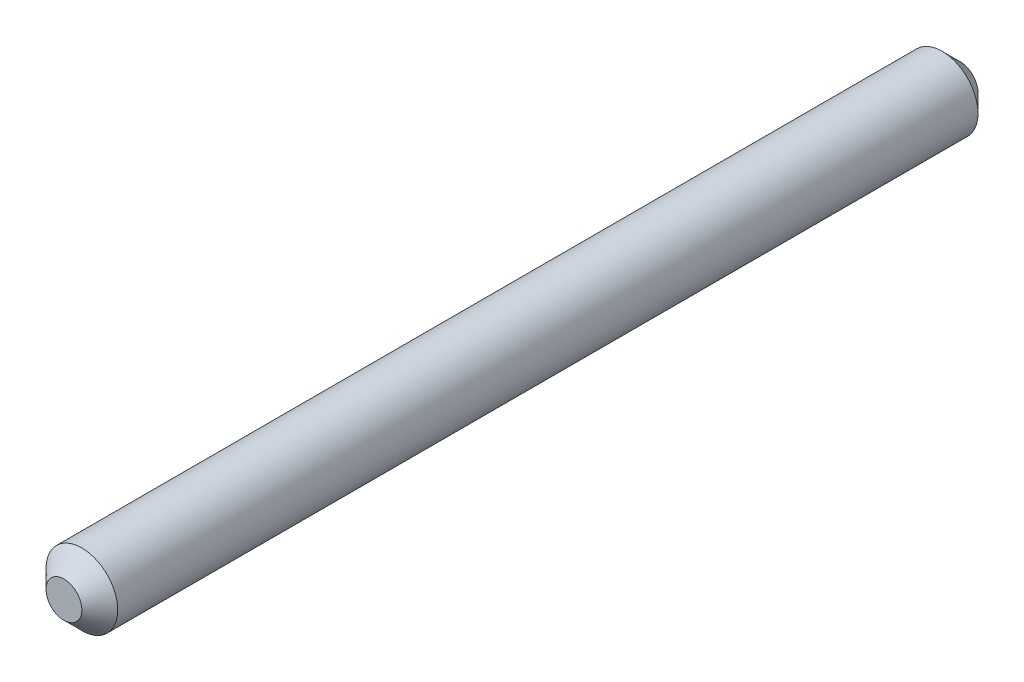
ISO-10303-21;
HEADER;
FILE_DESCRIPTION(('STEP AP214'),'2;1');
FILE_NAME('part.step','',(''),(''),'','','');
FILE_SCHEMA(('AUTOMOTIVE_DESIGN { 1 0 10303 214 1 1 1 1 }'));
ENDSEC;
DATA;
#1=APPLICATION_CONTEXT('core data for automotive mechanical design processes');
#2=APPLICATION_PROTOCOL_DEFINITION('international standard','automotive_design',2000,#1);
#3=PRODUCT_CONTEXT('',#1,'mechanical');
#4=PRODUCT('Part','Part','',(#3));
#5=PRODUCT_RELATED_PRODUCT_CATEGORY('part','',(#4));
#6=PRODUCT_DEFINITION_FORMATION('','',#4);
#7=PRODUCT_DEFINITION_CONTEXT('part definition',#1,'design');
#8=PRODUCT_DEFINITION('design','',#6,#7);
#9=PRODUCT_DEFINITION_SHAPE('','',#8);
#10=(LENGTH_UNIT() NAMED_UNIT(*) SI_UNIT(.MILLI.,.METRE.));
#11=(NAMED_UNIT(*) PLANE_ANGLE_UNIT() SI_UNIT($,.RADIAN.));
#12=(NAMED_UNIT(*) SI_UNIT($,.STERADIAN.) SOLID_ANGLE_UNIT());
#13=UNCERTAINTY_MEASURE_WITH_UNIT(LENGTH_MEASURE(1.E-05),#10,'distance_accuracy_value','');
#14=(GEOMETRIC_REPRESENTATION_CONTEXT(3) GLOBAL_UNCERTAINTY_ASSIGNED_CONTEXT((#13)) GLOBAL_UNIT_ASSIGNED_CONTEXT((#10,
#11,#12)) REPRESENTATION_CONTEXT('',''));
#15=CARTESIAN_POINT('',(0.,0.,0.));
#16=DIRECTION('',(0.,0.,1.));
#17=DIRECTION('',(1.,0.,0.));
#18=AXIS2_PLACEMENT_3D('',#15,#16,#17);
#19=CARTESIAN_POINT('',(0.,0.,25.));
#20=DIRECTION('',(0.,0.,-1.));
#21=DIRECTION('',(-1.,0.,0.));
#22=AXIS2_PLACEMENT_3D('',#19,#20,#21);
#23=CYLINDRICAL_SURFACE('',#22,1.);
#24=CARTESIAN_POINT('',(0.,0.,0.500000000000004));
#25=DIRECTION('',(0.,0.,1.));
#26=DIRECTION('',(1.,0.,0.));
#27=AXIS2_PLACEMENT_3D('',#24,#25,#26);
#28=CIRCLE('',#27,1.);
#29=CARTESIAN_POINT('',(1.,0.,0.500000000000004));
#30=VERTEX_POINT('',#29);
#31=EDGE_CURVE('E50',#30,#30,#28,.T.);
#32=ORIENTED_EDGE('',*,*,#31,.T.);
#33=EDGE_LOOP('',(#32));
#34=FACE_BOUND('',#33,.T.);
#35=CARTESIAN_POINT('',(0.,0.,24.5));
#36=DIRECTION('',(0.,0.,1.));
#37=DIRECTION('',(1.,0.,0.));
#38=AXIS2_PLACEMENT_3D('',#35,#36,#37);
#39=CIRCLE('',#38,1.);
#40=CARTESIAN_POINT('',(1.,0.,24.5));
#41=VERTEX_POINT('',#40);
#42=EDGE_CURVE('E55',#41,#41,#39,.F.);
#43=ORIENTED_EDGE('',*,*,#42,.T.);
#44=EDGE_LOOP('',(#43));
#45=FACE_BOUND('',#44,.T.);
#46=ADVANCED_FACE('F37',(#34,#45),#23,.T.);
#47=CARTESIAN_POINT('',(0.,0.,25.));
#48=DIRECTION('',(0.,0.,1.));
#49=DIRECTION('',(1.,0.,0.));
#50=AXIS2_PLACEMENT_3D('',#47,#48,#49);
#51=PLANE('',#50);
#52=CARTESIAN_POINT('',(0.,0.,25.));
#53=DIRECTION('',(0.,0.,1.));
#54=DIRECTION('',(1.,0.,0.));
#55=AXIS2_PLACEMENT_3D('',#52,#53,#54);
#56=CIRCLE('',#55,0.499999999999997);
#57=CARTESIAN_POINT('',(0.499999999999997,0.,25.));
#58=VERTEX_POINT('',#57);
#59=EDGE_CURVE('E10',#58,#58,#56,.T.);
#60=ORIENTED_EDGE('',*,*,#59,.T.);
#61=EDGE_LOOP('',(#60));
#62=FACE_BOUND('',#61,.T.);
#63=ADVANCED_FACE('F72',(#62),#51,.T.);
#64=CARTESIAN_POINT('',(0.,0.,0.));
#65=DIRECTION('',(0.,0.,1.));
#66=DIRECTION('',(1.,0.,0.));
#67=AXIS2_PLACEMENT_3D('',#64,#65,#66);
#68=PLANE('',#67);
#69=CARTESIAN_POINT('',(0.,0.,0.));
#70=DIRECTION('',(0.,0.,1.));
#71=DIRECTION('',(1.,0.,0.));
#72=AXIS2_PLACEMENT_3D('',#69,#70,#71);
#73=CIRCLE('',#72,0.499999999999994);
#74=CARTESIAN_POINT('',(0.499999999999994,0.,0.));
#75=VERTEX_POINT('',#74);
#76=EDGE_CURVE('E45',#75,#75,#73,.F.);
#77=ORIENTED_EDGE('',*,*,#76,.T.);
#78=EDGE_LOOP('',(#77));
#79=FACE_BOUND('',#78,.T.);
#80=ADVANCED_FACE('F69',(#79),#68,.F.);
#81=CARTESIAN_POINT('',(0.,0.,0.500000000000004));
#82=DIRECTION('',(0.,0.,1.));
#83=DIRECTION('',(1.,0.,0.));
#84=AXIS2_PLACEMENT_3D('',#81,#82,#83);
#85=CONICAL_SURFACE('',#84,1.,0.785398163397451);
#86=ORIENTED_EDGE('',*,*,#76,.F.);
#87=EDGE_LOOP('',(#86));
#88=FACE_BOUND('',#87,.T.);
#89=ORIENTED_EDGE('',*,*,#31,.F.);
#90=EDGE_LOOP('',(#89));
#91=FACE_BOUND('',#90,.T.);
#92=ADVANCED_FACE('F65',(#88,#91),#85,.T.);
#93=CARTESIAN_POINT('',(0.,0.,25.));
#94=DIRECTION('',(0.,0.,-1.));
#95=DIRECTION('',(-1.,0.,0.));
#96=AXIS2_PLACEMENT_3D('',#93,#94,#95);
#97=CONICAL_SURFACE('',#96,0.499999999999997,0.785398163397447);
#98=ORIENTED_EDGE('',*,*,#42,.F.);
#99=EDGE_LOOP('',(#98));
#100=FACE_BOUND('',#99,.T.);
#101=ORIENTED_EDGE('',*,*,#59,.F.);
#102=EDGE_LOOP('',(#101));
#103=FACE_BOUND('',#102,.T.);
#104=ADVANCED_FACE('F39',(#100,#103),#97,.T.);
#105=CLOSED_SHELL('',(#46,#63,#80,#92,#104));
#106=MANIFOLD_SOLID_BREP('B2',#105);
#107=ADVANCED_BREP_SHAPE_REPRESENTATION('',(#18,#106),#14);
#108=SHAPE_DEFINITION_REPRESENTATION(#9,#107);
ENDSEC;
END-ISO-10303-21;
